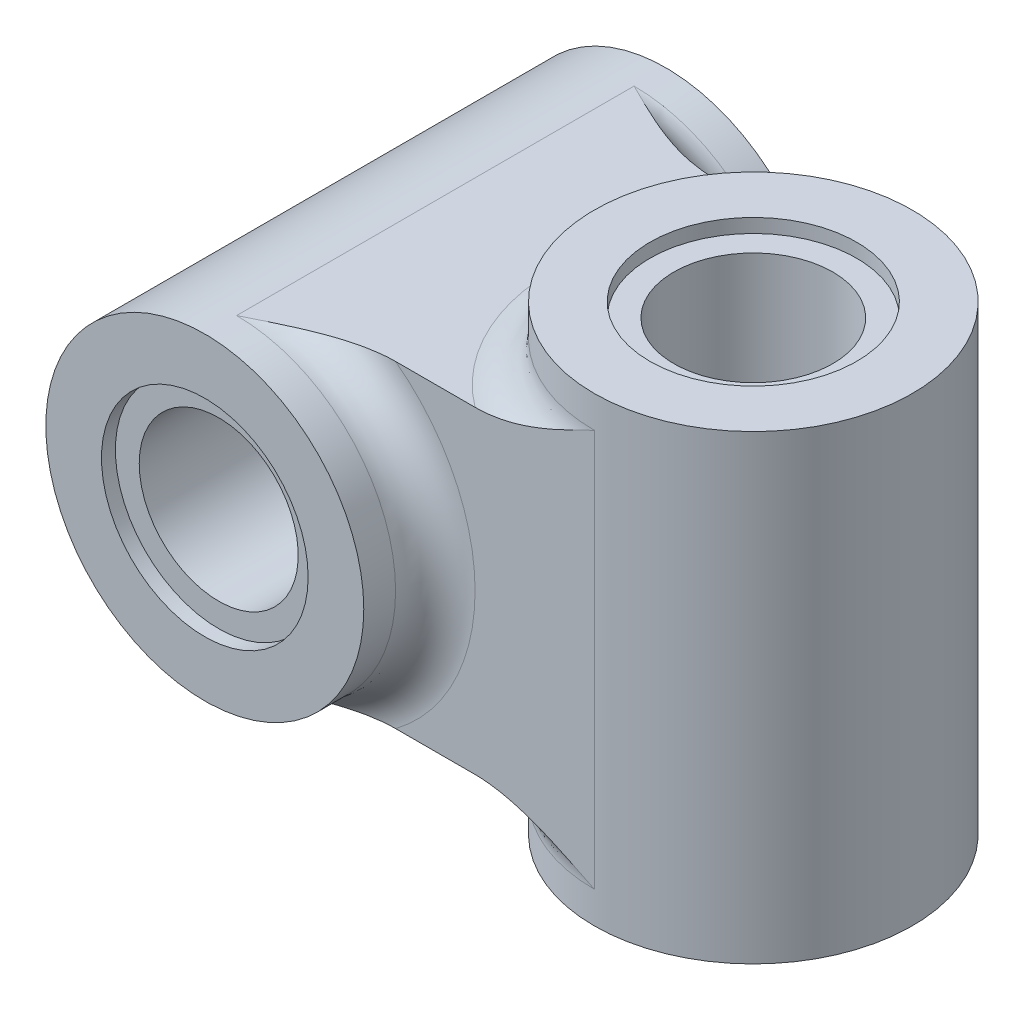
ISO-10303-21;
HEADER;
FILE_DESCRIPTION(('STEP AP214'),'2;1');
FILE_NAME('part.step','',(''),(''),'','','');
FILE_SCHEMA(('AUTOMOTIVE_DESIGN { 1 0 10303 214 1 1 1 1 }'));
ENDSEC;
DATA;
#1=APPLICATION_CONTEXT('core data for automotive mechanical design processes');
#2=APPLICATION_PROTOCOL_DEFINITION('international standard','automotive_design',2000,#1);
#3=PRODUCT_CONTEXT('',#1,'mechanical');
#4=PRODUCT('Part','Part','',(#3));
#5=PRODUCT_RELATED_PRODUCT_CATEGORY('part','',(#4));
#6=PRODUCT_DEFINITION_FORMATION('','',#4);
#7=PRODUCT_DEFINITION_CONTEXT('part definition',#1,'design');
#8=PRODUCT_DEFINITION('design','',#6,#7);
#9=PRODUCT_DEFINITION_SHAPE('','',#8);
#10=(LENGTH_UNIT() NAMED_UNIT(*) SI_UNIT(.MILLI.,.METRE.));
#11=(NAMED_UNIT(*) PLANE_ANGLE_UNIT() SI_UNIT($,.RADIAN.));
#12=(NAMED_UNIT(*) SI_UNIT($,.STERADIAN.) SOLID_ANGLE_UNIT());
#13=UNCERTAINTY_MEASURE_WITH_UNIT(LENGTH_MEASURE(1.E-05),#10,'distance_accuracy_value','');
#14=(GEOMETRIC_REPRESENTATION_CONTEXT(3) GLOBAL_UNCERTAINTY_ASSIGNED_CONTEXT((#13)) GLOBAL_UNIT_ASSIGNED_CONTEXT((#10,
#11,#12)) REPRESENTATION_CONTEXT('',''));
#15=CARTESIAN_POINT('',(0.,0.,0.));
#16=DIRECTION('',(0.,0.,1.));
#17=DIRECTION('',(1.,0.,0.));
#18=AXIS2_PLACEMENT_3D('',#15,#16,#17);
#19=CARTESIAN_POINT('',(40.,29.,29.));
#20=DIRECTION('',(0.,-1.,0.));
#21=DIRECTION('',(0.,0.,-1.));
#22=AXIS2_PLACEMENT_3D('',#19,#20,#21);
#23=CYLINDRICAL_SURFACE('',#22,10.);
#24=CARTESIAN_POINT('',(40.,27.25,29.));
#25=DIRECTION('',(0.,1.,0.));
#26=DIRECTION('',(0.,0.,1.));
#27=AXIS2_PLACEMENT_3D('',#24,#25,#26);
#28=CIRCLE('',#27,10.);
#29=CARTESIAN_POINT('',(40.,27.25,19.));
#30=VERTEX_POINT('',#29);
#31=EDGE_CURVE('E201',#30,#30,#28,.T.);
#32=CARTESIAN_POINT('',(40.,-27.25,29.));
#33=DIRECTION('',(0.,-1.,0.));
#34=DIRECTION('',(0.,0.,-1.));
#35=AXIS2_PLACEMENT_3D('',#32,#33,#34);
#36=CIRCLE('',#35,10.);
#37=CARTESIAN_POINT('',(40.,-27.25,19.));
#38=VERTEX_POINT('',#37);
#39=EDGE_CURVE('E46',#38,#38,#36,.T.);
#40=CARTESIAN_POINT('',(40.,27.25,19.));
#41=CARTESIAN_POINT('',(40.,26.6822916666667,19.));
#42=CARTESIAN_POINT('',(40.,26.1145833333333,19.));
#43=CARTESIAN_POINT('',(40.,24.9791666666667,19.));
#44=CARTESIAN_POINT('',(40.,24.4114583333333,19.));
#45=CARTESIAN_POINT('',(40.,23.2760416666667,19.));
#46=CARTESIAN_POINT('',(40.,22.7083333333333,19.));
#47=CARTESIAN_POINT('',(40.,21.5729166666667,19.));
#48=CARTESIAN_POINT('',(40.,21.0052083333333,19.));
#49=CARTESIAN_POINT('',(40.,19.8697916666667,19.));
#50=CARTESIAN_POINT('',(40.,19.3020833333333,19.));
#51=CARTESIAN_POINT('',(40.,18.1666666666667,19.));
#52=CARTESIAN_POINT('',(40.,17.5989583333333,19.));
#53=CARTESIAN_POINT('',(40.,16.4635416666667,19.));
#54=CARTESIAN_POINT('',(40.,15.8958333333333,19.));
#55=CARTESIAN_POINT('',(40.,14.7604166666667,19.));
#56=CARTESIAN_POINT('',(40.,14.1927083333333,19.));
#57=CARTESIAN_POINT('',(40.,13.0572916666667,19.));
#58=CARTESIAN_POINT('',(40.,12.4895833333333,19.));
#59=CARTESIAN_POINT('',(40.,11.3541666666667,19.));
#60=CARTESIAN_POINT('',(40.,10.7864583333333,19.));
#61=CARTESIAN_POINT('',(40.,9.65104166666667,19.));
#62=CARTESIAN_POINT('',(40.,9.08333333333333,19.));
#63=CARTESIAN_POINT('',(40.,7.94791666666667,19.));
#64=CARTESIAN_POINT('',(40.,7.38020833333333,19.));
#65=CARTESIAN_POINT('',(40.,6.24479166666667,19.));
#66=CARTESIAN_POINT('',(40.,5.67708333333333,19.));
#67=CARTESIAN_POINT('',(40.,4.54166666666667,19.));
#68=CARTESIAN_POINT('',(40.,3.97395833333333,19.));
#69=CARTESIAN_POINT('',(40.,2.83854166666667,19.));
#70=CARTESIAN_POINT('',(40.,2.27083333333333,19.));
#71=CARTESIAN_POINT('',(40.,1.13541666666667,19.));
#72=CARTESIAN_POINT('',(40.,0.567708333333333,19.));
#73=CARTESIAN_POINT('',(40.,-0.567708333333333,19.));
#74=CARTESIAN_POINT('',(40.,-1.13541666666667,19.));
#75=CARTESIAN_POINT('',(40.,-2.27083333333333,19.));
#76=CARTESIAN_POINT('',(40.,-2.83854166666666,19.));
#77=CARTESIAN_POINT('',(40.,-3.97395833333333,19.));
#78=CARTESIAN_POINT('',(40.,-4.54166666666666,19.));
#79=CARTESIAN_POINT('',(40.,-5.67708333333333,19.));
#80=CARTESIAN_POINT('',(40.,-6.24479166666666,19.));
#81=CARTESIAN_POINT('',(40.,-7.38020833333333,19.));
#82=CARTESIAN_POINT('',(40.,-7.94791666666666,19.));
#83=CARTESIAN_POINT('',(40.,-9.08333333333333,19.));
#84=CARTESIAN_POINT('',(40.,-9.65104166666666,19.));
#85=CARTESIAN_POINT('',(40.,-10.7864583333333,19.));
#86=CARTESIAN_POINT('',(40.,-11.3541666666667,19.));
#87=CARTESIAN_POINT('',(40.,-12.4895833333333,19.));
#88=CARTESIAN_POINT('',(40.,-13.0572916666667,19.));
#89=CARTESIAN_POINT('',(40.,-14.1927083333333,19.));
#90=CARTESIAN_POINT('',(40.,-14.7604166666667,19.));
#91=CARTESIAN_POINT('',(40.,-15.8958333333333,19.));
#92=CARTESIAN_POINT('',(40.,-16.4635416666667,19.));
#93=CARTESIAN_POINT('',(40.,-17.5989583333333,19.));
#94=CARTESIAN_POINT('',(40.,-18.1666666666667,19.));
#95=CARTESIAN_POINT('',(40.,-19.3020833333333,19.));
#96=CARTESIAN_POINT('',(40.,-19.8697916666667,19.));
#97=CARTESIAN_POINT('',(40.,-21.0052083333333,19.));
#98=CARTESIAN_POINT('',(40.,-21.5729166666667,19.));
#99=CARTESIAN_POINT('',(40.,-22.7083333333333,19.));
#100=CARTESIAN_POINT('',(40.,-23.2760416666667,19.));
#101=CARTESIAN_POINT('',(40.,-24.4114583333333,19.));
#102=CARTESIAN_POINT('',(40.,-24.9791666666667,19.));
#103=CARTESIAN_POINT('',(40.,-26.1145833333333,19.));
#104=CARTESIAN_POINT('',(40.,-26.6822916666667,19.));
#105=CARTESIAN_POINT('',(40.,-27.25,19.));
#106=B_SPLINE_CURVE_WITH_KNOTS('',3,(#40,#41,#42,#43,#44,#45,#46,#47,#48,#49,#50,#51,#52,#53,
#54,#55,#56,#57,#58,#59,#60,#61,#62,#63,#64,#65,#66,#67,#68,#69,#70,#71,#72,#73,#74,#75,#76,#77,
#78,#79,#80,#81,#82,#83,#84,#85,#86,#87,#88,#89,#90,#91,#92,#93,#94,#95,#96,#97,#98,#99,#100,
#101,#102,#103,#104,#105),.UNSPECIFIED.,.F.,.F.,(4,2,2,2,2,2,2,2,2,2,2,2,2,2,2,2,2,2,2,2,2,2,2,
2,2,2,2,2,2,2,2,2,4),(0.,1.703125,3.40625,5.109375,6.8125,8.515625,10.21875,11.921875,13.625,
15.328125,17.03125,18.734375,20.4375,22.140625,23.84375,25.546875,27.25,28.953125,30.65625,
32.359375,34.0625,35.765625,37.46875,39.171875,40.875,42.578125,44.28125,45.984375,47.6875,
49.390625,51.09375,52.796875,54.5),.UNSPECIFIED.);
#107=EDGE_CURVE('BSEAM41',#30,#38,#106,.T.);
#108=ORIENTED_EDGE('',*,*,#31,.T.);
#109=ORIENTED_EDGE('',*,*,#39,.T.);
#110=ORIENTED_EDGE('',*,*,#107,.T.);
#111=ORIENTED_EDGE('',*,*,#107,.F.);
#112=EDGE_LOOP('',(#108,#110,#109,#111));
#113=FACE_BOUND('',#112,.T.);
#114=ADVANCED_FACE('F41',(#113),#23,.F.);
#115=CARTESIAN_POINT('',(0.,0.,58.));
#116=DIRECTION('',(0.,0.,-1.));
#117=DIRECTION('',(-1.,0.,0.));
#118=AXIS2_PLACEMENT_3D('',#115,#116,#117);
#119=CYLINDRICAL_SURFACE('',#118,10.);
#120=CARTESIAN_POINT('',(0.,0.,1.75));
#121=DIRECTION('',(0.,0.,-1.));
#122=DIRECTION('',(-1.,0.,0.));
#123=AXIS2_PLACEMENT_3D('',#120,#121,#122);
#124=CIRCLE('',#123,10.);
#125=CARTESIAN_POINT('',(-10.,0.,1.75));
#126=VERTEX_POINT('',#125);
#127=EDGE_CURVE('E192',#126,#126,#124,.T.);
#128=CARTESIAN_POINT('',(0.,0.,56.25));
#129=DIRECTION('',(0.,0.,1.));
#130=DIRECTION('',(1.,0.,0.));
#131=AXIS2_PLACEMENT_3D('',#128,#129,#130);
#132=CIRCLE('',#131,10.);
#133=CARTESIAN_POINT('',(-10.,0.,56.25));
#134=VERTEX_POINT('',#133);
#135=EDGE_CURVE('E197',#134,#134,#132,.T.);
#136=CARTESIAN_POINT('',(-10.,0.,1.75));
#137=CARTESIAN_POINT('',(-10.,0.,2.31770833333334));
#138=CARTESIAN_POINT('',(-10.,0.,2.88541666666667));
#139=CARTESIAN_POINT('',(-10.,0.,4.02083333333333));
#140=CARTESIAN_POINT('',(-10.,0.,4.58854166666667));
#141=CARTESIAN_POINT('',(-10.,0.,5.72395833333333));
#142=CARTESIAN_POINT('',(-10.,0.,6.29166666666667));
#143=CARTESIAN_POINT('',(-10.,0.,7.42708333333333));
#144=CARTESIAN_POINT('',(-10.,0.,7.99479166666667));
#145=CARTESIAN_POINT('',(-10.,0.,9.13020833333333));
#146=CARTESIAN_POINT('',(-10.,0.,9.69791666666667));
#147=CARTESIAN_POINT('',(-10.,0.,10.8333333333333));
#148=CARTESIAN_POINT('',(-10.,0.,11.4010416666667));
#149=CARTESIAN_POINT('',(-10.,0.,12.5364583333333));
#150=CARTESIAN_POINT('',(-10.,0.,13.1041666666667));
#151=CARTESIAN_POINT('',(-10.,0.,14.2395833333333));
#152=CARTESIAN_POINT('',(-10.,0.,14.8072916666667));
#153=CARTESIAN_POINT('',(-10.,0.,15.9427083333333));
#154=CARTESIAN_POINT('',(-10.,0.,16.5104166666667));
#155=CARTESIAN_POINT('',(-10.,0.,17.6458333333333));
#156=CARTESIAN_POINT('',(-10.,0.,18.2135416666667));
#157=CARTESIAN_POINT('',(-10.,0.,19.3489583333333));
#158=CARTESIAN_POINT('',(-10.,0.,19.9166666666667));
#159=CARTESIAN_POINT('',(-10.,0.,21.0520833333333));
#160=CARTESIAN_POINT('',(-10.,0.,21.6197916666667));
#161=CARTESIAN_POINT('',(-10.,0.,22.7552083333333));
#162=CARTESIAN_POINT('',(-10.,0.,23.3229166666667));
#163=CARTESIAN_POINT('',(-10.,0.,24.4583333333333));
#164=CARTESIAN_POINT('',(-10.,0.,25.0260416666667));
#165=CARTESIAN_POINT('',(-10.,0.,26.1614583333333));
#166=CARTESIAN_POINT('',(-10.,0.,26.7291666666667));
#167=CARTESIAN_POINT('',(-10.,0.,27.8645833333333));
#168=CARTESIAN_POINT('',(-10.,0.,28.4322916666667));
#169=CARTESIAN_POINT('',(-10.,0.,29.5677083333333));
#170=CARTESIAN_POINT('',(-10.,0.,30.1354166666667));
#171=CARTESIAN_POINT('',(-10.,0.,31.2708333333333));
#172=CARTESIAN_POINT('',(-10.,0.,31.8385416666667));
#173=CARTESIAN_POINT('',(-10.,0.,32.9739583333333));
#174=CARTESIAN_POINT('',(-10.,0.,33.5416666666667));
#175=CARTESIAN_POINT('',(-10.,0.,34.6770833333333));
#176=CARTESIAN_POINT('',(-10.,0.,35.2447916666667));
#177=CARTESIAN_POINT('',(-10.,0.,36.3802083333333));
#178=CARTESIAN_POINT('',(-10.,0.,36.9479166666667));
#179=CARTESIAN_POINT('',(-10.,0.,38.0833333333333));
#180=CARTESIAN_POINT('',(-10.,0.,38.6510416666667));
#181=CARTESIAN_POINT('',(-10.,0.,39.7864583333333));
#182=CARTESIAN_POINT('',(-10.,0.,40.3541666666667));
#183=CARTESIAN_POINT('',(-10.,0.,41.4895833333333));
#184=CARTESIAN_POINT('',(-10.,0.,42.0572916666667));
#185=CARTESIAN_POINT('',(-10.,0.,43.1927083333333));
#186=CARTESIAN_POINT('',(-10.,0.,43.7604166666667));
#187=CARTESIAN_POINT('',(-10.,0.,44.8958333333333));
#188=CARTESIAN_POINT('',(-10.,0.,45.4635416666667));
#189=CARTESIAN_POINT('',(-10.,0.,46.5989583333333));
#190=CARTESIAN_POINT('',(-10.,0.,47.1666666666667));
#191=CARTESIAN_POINT('',(-10.,0.,48.3020833333333));
#192=CARTESIAN_POINT('',(-10.,0.,48.8697916666667));
#193=CARTESIAN_POINT('',(-10.,0.,50.0052083333333));
#194=CARTESIAN_POINT('',(-10.,0.,50.5729166666667));
#195=CARTESIAN_POINT('',(-10.,0.,51.7083333333333));
#196=CARTESIAN_POINT('',(-10.,0.,52.2760416666667));
#197=CARTESIAN_POINT('',(-10.,0.,53.4114583333333));
#198=CARTESIAN_POINT('',(-10.,0.,53.9791666666667));
#199=CARTESIAN_POINT('',(-10.,0.,55.1145833333333));
#200=CARTESIAN_POINT('',(-10.,0.,55.6822916666667));
#201=CARTESIAN_POINT('',(-10.,0.,56.25));
#202=B_SPLINE_CURVE_WITH_KNOTS('',3,(#136,#137,#138,#139,#140,#141,#142,#143,#144,#145,#146,
#147,#148,#149,#150,#151,#152,#153,#154,#155,#156,#157,#158,#159,#160,#161,#162,#163,#164,#165,
#166,#167,#168,#169,#170,#171,#172,#173,#174,#175,#176,#177,#178,#179,#180,#181,#182,#183,#184,
#185,#186,#187,#188,#189,#190,#191,#192,#193,#194,#195,#196,#197,#198,#199,#200,#201),
.UNSPECIFIED.,.F.,.F.,(4,2,2,2,2,2,2,2,2,2,2,2,2,2,2,2,2,2,2,2,2,2,2,2,2,2,2,2,2,2,2,2,4),(0.,
1.703125,3.40625,5.109375,6.8125,8.515625,10.21875,11.921875,13.625,15.328125,17.03125,
18.734375,20.4375,22.140625,23.84375,25.546875,27.25,28.953125,30.65625,32.359375,34.0625,
35.765625,37.46875,39.171875,40.875,42.578125,44.28125,45.984375,47.6875,49.390625,51.09375,
52.796875,54.5),.UNSPECIFIED.);
#203=EDGE_CURVE('BSEAM298',#126,#134,#202,.T.);
#204=ORIENTED_EDGE('',*,*,#127,.T.);
#205=ORIENTED_EDGE('',*,*,#135,.T.);
#206=ORIENTED_EDGE('',*,*,#203,.T.);
#207=ORIENTED_EDGE('',*,*,#203,.F.);
#208=EDGE_LOOP('',(#204,#206,#205,#207));
#209=FACE_BOUND('',#208,.T.);
#210=ADVANCED_FACE('F298',(#209),#119,.F.);
#211=CARTESIAN_POINT('',(0.,0.,58.));
#212=DIRECTION('',(0.,0.,1.));
#213=DIRECTION('',(1.,0.,0.));
#214=AXIS2_PLACEMENT_3D('',#211,#212,#213);
#215=PLANE('',#214);
#216=CARTESIAN_POINT('',(0.,0.,58.));
#217=DIRECTION('',(0.,0.,1.));
#218=DIRECTION('',(1.,0.,0.));
#219=AXIS2_PLACEMENT_3D('',#216,#217,#218);
#220=CIRCLE('',#219,13.);
#221=CARTESIAN_POINT('',(13.,0.,58.));
#222=VERTEX_POINT('',#221);
#223=EDGE_CURVE('E203',#222,#222,#220,.T.);
#224=ORIENTED_EDGE('',*,*,#223,.F.);
#225=EDGE_LOOP('',(#224));
#226=FACE_BOUND('',#225,.T.);
#227=CARTESIAN_POINT('',(0.,0.,58.));
#228=DIRECTION('',(0.,0.,1.));
#229=DIRECTION('',(1.,0.,0.));
#230=AXIS2_PLACEMENT_3D('',#227,#228,#229);
#231=CIRCLE('',#230,20.);
#232=CARTESIAN_POINT('',(20.,0.,58.));
#233=VERTEX_POINT('',#232);
#234=EDGE_CURVE('E124',#233,#233,#231,.T.);
#235=ORIENTED_EDGE('',*,*,#234,.T.);
#236=EDGE_LOOP('',(#235));
#237=FACE_BOUND('',#236,.T.);
#238=ADVANCED_FACE('F305',(#226,#237),#215,.T.);
#239=CARTESIAN_POINT('',(0.,0.,0.));
#240=DIRECTION('',(0.,0.,1.));
#241=DIRECTION('',(1.,0.,0.));
#242=AXIS2_PLACEMENT_3D('',#239,#240,#241);
#243=PLANE('',#242);
#244=CARTESIAN_POINT('',(0.,0.,0.));
#245=DIRECTION('',(0.,0.,-1.));
#246=DIRECTION('',(-1.,0.,0.));
#247=AXIS2_PLACEMENT_3D('',#244,#245,#246);
#248=CIRCLE('',#247,13.);
#249=CARTESIAN_POINT('',(-13.,0.,0.));
#250=VERTEX_POINT('',#249);
#251=EDGE_CURVE('E199',#250,#250,#248,.T.);
#252=ORIENTED_EDGE('',*,*,#251,.F.);
#253=EDGE_LOOP('',(#252));
#254=FACE_BOUND('',#253,.T.);
#255=CARTESIAN_POINT('',(0.,0.,0.));
#256=DIRECTION('',(0.,0.,1.));
#257=DIRECTION('',(1.,0.,0.));
#258=AXIS2_PLACEMENT_3D('',#255,#256,#257);
#259=CIRCLE('',#258,20.);
#260=CARTESIAN_POINT('',(20.,0.,0.));
#261=VERTEX_POINT('',#260);
#262=EDGE_CURVE('E239',#261,#261,#259,.T.);
#263=ORIENTED_EDGE('',*,*,#262,.F.);
#264=EDGE_LOOP('',(#263));
#265=FACE_BOUND('',#264,.T.);
#266=ADVANCED_FACE('F467',(#254,#265),#243,.F.);
#267=CARTESIAN_POINT('',(0.,0.,58.));
#268=DIRECTION('',(0.,0.,-1.));
#269=DIRECTION('',(-1.,0.,0.));
#270=AXIS2_PLACEMENT_3D('',#267,#268,#269);
#271=CYLINDRICAL_SURFACE('',#270,20.);
#272=DIRECTION('',(0.,0.,-1.));
#273=VECTOR('',#272,1.);
#274=CARTESIAN_POINT('',(0.,20.,49.));
#275=LINE('',#274,#273);
#276=CARTESIAN_POINT('',(0.,20.,54.));
#277=VERTEX_POINT('',#276);
#278=CARTESIAN_POINT('',(0.,20.,3.99999999999999));
#279=VERTEX_POINT('',#278);
#280=EDGE_CURVE('E229',#277,#279,#275,.T.);
#281=ORIENTED_EDGE('',*,*,#280,.T.);
#282=CARTESIAN_POINT('',(0.,0.,3.99999999999998));
#283=DIRECTION('',(0.,0.,1.));
#284=DIRECTION('',(0.,-1.,0.));
#285=AXIS2_PLACEMENT_3D('',#282,#283,#284);
#286=CIRCLE('',#285,20.);
#287=CARTESIAN_POINT('',(0.,-20.,3.99999999999998));
#288=VERTEX_POINT('',#287);
#289=EDGE_CURVE('E260',#279,#288,#286,.F.);
#290=ORIENTED_EDGE('',*,*,#289,.T.);
#291=DIRECTION('',(0.,0.,-1.));
#292=VECTOR('',#291,1.);
#293=CARTESIAN_POINT('',(0.,-20.,49.));
#294=LINE('',#293,#292);
#295=CARTESIAN_POINT('',(0.,-20.,54.));
#296=VERTEX_POINT('',#295);
#297=EDGE_CURVE('E116',#296,#288,#294,.T.);
#298=ORIENTED_EDGE('',*,*,#297,.F.);
#299=CARTESIAN_POINT('',(0.,0.,54.));
#300=DIRECTION('',(0.,0.,1.));
#301=DIRECTION('',(1.,0.,0.));
#302=AXIS2_PLACEMENT_3D('',#299,#300,#301);
#303=CIRCLE('',#302,20.);
#304=EDGE_CURVE('E257',#296,#277,#303,.T.);
#305=ORIENTED_EDGE('',*,*,#304,.T.);
#306=EDGE_LOOP('',(#281,#290,#298,#305));
#307=FACE_BOUND('',#306,.T.);
#308=ORIENTED_EDGE('',*,*,#234,.F.);
#309=EDGE_LOOP('',(#308));
#310=FACE_BOUND('',#309,.T.);
#311=ORIENTED_EDGE('',*,*,#262,.T.);
#312=EDGE_LOOP('',(#311));
#313=FACE_BOUND('',#312,.T.);
#314=ADVANCED_FACE('F282',(#307,#310,#313),#271,.T.);
#315=CARTESIAN_POINT('',(40.,-20.,49.));
#316=DIRECTION('',(0.,0.,1.));
#317=DIRECTION('',(1.,0.,0.));
#318=AXIS2_PLACEMENT_3D('',#315,#316,#317);
#319=PLANE('',#318);
#320=DIRECTION('',(-1.,0.,0.));
#321=VECTOR('',#320,1.);
#322=CARTESIAN_POINT('',(40.,20.,49.));
#323=LINE('',#322,#321);
#324=CARTESIAN_POINT('',(25.,20.,49.));
#325=VERTEX_POINT('',#324);
#326=CARTESIAN_POINT('',(15.,20.,49.));
#327=VERTEX_POINT('',#326);
#328=EDGE_CURVE('E233',#325,#327,#323,.T.);
#329=ORIENTED_EDGE('',*,*,#328,.T.);
#330=CARTESIAN_POINT('',(0.,0.,49.));
#331=DIRECTION('',(0.,0.,1.));
#332=DIRECTION('',(1.,0.,0.));
#333=AXIS2_PLACEMENT_3D('',#330,#331,#332);
#334=CIRCLE('',#333,25.);
#335=CARTESIAN_POINT('',(15.,-20.,49.));
#336=VERTEX_POINT('',#335);
#337=EDGE_CURVE('E264',#327,#336,#334,.F.);
#338=ORIENTED_EDGE('',*,*,#337,.T.);
#339=DIRECTION('',(-1.,0.,0.));
#340=VECTOR('',#339,1.);
#341=CARTESIAN_POINT('',(40.,-20.,49.));
#342=LINE('',#341,#340);
#343=CARTESIAN_POINT('',(25.,-20.,49.));
#344=VERTEX_POINT('',#343);
#345=EDGE_CURVE('E236',#344,#336,#342,.T.);
#346=ORIENTED_EDGE('',*,*,#345,.F.);
#347=CARTESIAN_POINT('',(25.,-20.,49.));
#348=CARTESIAN_POINT('',(25.2651282089429,-20.0000248440085,49.));
#349=CARTESIAN_POINT('',(25.5301771044987,-20.007589934337,49.));
#350=CARTESIAN_POINT('',(26.0593880846254,-20.0364294351582,49.));
#351=CARTESIAN_POINT('',(26.3235505882963,-20.0576960351639,49.));
#352=CARTESIAN_POINT('',(26.8497890843893,-20.1124898408836,49.));
#353=CARTESIAN_POINT('',(27.1118689280912,-20.145980810748,49.));
#354=CARTESIAN_POINT('',(27.6343923106904,-20.2240499150372,49.));
#355=CARTESIAN_POINT('',(27.8948355873029,-20.2686297823921,49.));
#356=CARTESIAN_POINT('',(28.6664609884388,-20.4160433975464,49.));
#357=CARTESIAN_POINT('',(29.1749087512093,-20.5333381947335,49.));
#358=CARTESIAN_POINT('',(30.1837126611257,-20.7995778005164,49.));
#359=CARTESIAN_POINT('',(30.6840614597819,-20.9485497892506,49.));
#360=CARTESIAN_POINT('',(31.5605831445864,-21.2342047748402,49.));
#361=CARTESIAN_POINT('',(31.9384874405667,-21.3656435859749,49.));
#362=CARTESIAN_POINT('',(32.6897037488905,-21.6410837307938,49.));
#363=CARTESIAN_POINT('',(33.0630153714214,-21.7850861225578,49.));
#364=CARTESIAN_POINT('',(34.176661641421,-22.2325984737774,49.));
#365=CARTESIAN_POINT('',(34.9107431272673,-22.5516256043198,49.));
#366=CARTESIAN_POINT('',(36.3696325965115,-23.216950662706,49.));
#367=CARTESIAN_POINT('',(37.0943930587858,-23.5633504064254,49.));
#368=CARTESIAN_POINT('',(38.5376845637521,-24.2689287241272,49.));
#369=CARTESIAN_POINT('',(39.2562150092713,-24.6281085066499,49.));
#370=CARTESIAN_POINT('',(39.9831345201157,-24.9915672610964,49.));
#371=CARTESIAN_POINT('',(39.9915672605557,-24.9957836313378,49.));
#372=CARTESIAN_POINT('',(40.,-25.,49.));
#373=B_SPLINE_CURVE_WITH_KNOTS('',3,(#347,#348,#349,#350,#351,#352,#353,#354,#355,#356,#357,
#358,#359,#360,#361,#362,#363,#364,#365,#366,#367,#368,#369,#370,#371,#372),.UNSPECIFIED.,.F.,
.F.,(4,2,2,2,2,2,2,2,2,2,2,2,4),(0.,0.795162748327174,1.58987261810577,2.38224566558403,
3.17474261995516,4.73875375654246,6.30411232391702,7.50419539676254,8.70437963595933,
11.1046360659497,13.5142837354925,15.9241598813816,15.952444152629),.UNSPECIFIED.);
#374=CARTESIAN_POINT('',(40.,-25.,49.));
#375=VERTEX_POINT('',#374);
#376=EDGE_CURVE('E111',#344,#375,#373,.T.);
#377=ORIENTED_EDGE('',*,*,#376,.T.);
#378=DIRECTION('',(0.,1.,0.));
#379=VECTOR('',#378,1.);
#380=CARTESIAN_POINT('',(40.,-20.,49.));
#381=LINE('',#380,#379);
#382=CARTESIAN_POINT('',(40.,25.,49.));
#383=VERTEX_POINT('',#382);
#384=EDGE_CURVE('E106',#375,#383,#381,.T.);
#385=ORIENTED_EDGE('',*,*,#384,.T.);
#386=CARTESIAN_POINT('',(25.,20.,49.));
#387=CARTESIAN_POINT('',(25.2651282089429,20.0000248440085,49.));
#388=CARTESIAN_POINT('',(25.5301771044987,20.007589934337,49.));
#389=CARTESIAN_POINT('',(26.0593880846254,20.0364294351582,49.));
#390=CARTESIAN_POINT('',(26.3235505882963,20.0576960351639,49.));
#391=CARTESIAN_POINT('',(26.8497890843893,20.1124898408836,49.));
#392=CARTESIAN_POINT('',(27.1118689280912,20.145980810748,49.));
#393=CARTESIAN_POINT('',(27.6343923106904,20.2240499150372,49.));
#394=CARTESIAN_POINT('',(27.8948355873029,20.2686297823921,49.));
#395=CARTESIAN_POINT('',(28.6664609884388,20.4160433975464,49.));
#396=CARTESIAN_POINT('',(29.1749087512093,20.5333381947335,49.));
#397=CARTESIAN_POINT('',(30.1837126611257,20.7995778005164,49.));
#398=CARTESIAN_POINT('',(30.6840614597819,20.9485497892506,49.));
#399=CARTESIAN_POINT('',(31.5605831445864,21.2342047748402,49.));
#400=CARTESIAN_POINT('',(31.9384874405667,21.3656435859748,49.));
#401=CARTESIAN_POINT('',(32.6897037488905,21.6410837307938,49.));
#402=CARTESIAN_POINT('',(33.0630153714214,21.7850861225578,49.));
#403=CARTESIAN_POINT('',(34.176661641421,22.2325984737774,49.));
#404=CARTESIAN_POINT('',(34.9107431272673,22.5516256043198,49.));
#405=CARTESIAN_POINT('',(36.3696325965115,23.216950662706,49.));
#406=CARTESIAN_POINT('',(37.0943930587858,23.5633504064254,49.));
#407=CARTESIAN_POINT('',(38.5376845637521,24.2689287241272,49.));
#408=CARTESIAN_POINT('',(39.2562150092713,24.6281085066499,49.));
#409=CARTESIAN_POINT('',(39.9831345201157,24.9915672610964,49.));
#410=CARTESIAN_POINT('',(39.9915672605557,24.9957836313378,49.));
#411=CARTESIAN_POINT('',(40.,25.,49.));
#412=B_SPLINE_CURVE_WITH_KNOTS('',3,(#386,#387,#388,#389,#390,#391,#392,#393,#394,#395,#396,
#397,#398,#399,#400,#401,#402,#403,#404,#405,#406,#407,#408,#409,#410,#411),.UNSPECIFIED.,.F.,
.F.,(4,2,2,2,2,2,2,2,2,2,2,2,4),(0.,0.795162748327174,1.58987261810577,2.38224566558403,
3.17474261995516,4.73875375654246,6.30411232391702,7.50419539676255,8.70437963595933,
11.1046360659497,13.5142837354925,15.9241598813816,15.952444152629),.UNSPECIFIED.);
#413=EDGE_CURVE('E65',#383,#325,#412,.F.);
#414=ORIENTED_EDGE('',*,*,#413,.T.);
#415=EDGE_LOOP('',(#329,#338,#346,#377,#385,#414));
#416=FACE_BOUND('',#415,.T.);
#417=ADVANCED_FACE('F108',(#416),#319,.T.);
#418=CARTESIAN_POINT('',(40.,-20.,49.));
#419=DIRECTION('',(0.,1.,0.));
#420=DIRECTION('',(0.,0.,1.));
#421=AXIS2_PLACEMENT_3D('',#418,#419,#420);
#422=PLANE('',#421);
#423=DIRECTION('',(-1.,0.,0.));
#424=VECTOR('',#423,1.);
#425=CARTESIAN_POINT('',(40.,-20.,8.99999999999998));
#426=LINE('',#425,#424);
#427=CARTESIAN_POINT('',(25.,-20.,8.99999999999998));
#428=VERTEX_POINT('',#427);
#429=CARTESIAN_POINT('',(15.,-20.,8.99999999999998));
#430=VERTEX_POINT('',#429);
#431=EDGE_CURVE('E240',#428,#430,#426,.T.);
#432=ORIENTED_EDGE('',*,*,#431,.F.);
#433=CARTESIAN_POINT('',(40.,-20.,29.));
#434=DIRECTION('',(0.,1.,0.));
#435=DIRECTION('',(0.,0.,1.));
#436=AXIS2_PLACEMENT_3D('',#433,#434,#435);
#437=CIRCLE('',#436,25.);
#438=EDGE_CURVE('E252',#428,#344,#437,.T.);
#439=ORIENTED_EDGE('',*,*,#438,.T.);
#440=ORIENTED_EDGE('',*,*,#345,.T.);
#441=CARTESIAN_POINT('',(15.,-20.,49.));
#442=CARTESIAN_POINT('',(14.734871791058,-20.,49.0000248440085));
#443=CARTESIAN_POINT('',(14.4698228955031,-20.,49.007589934337));
#444=CARTESIAN_POINT('',(13.9406119153781,-20.,49.036429435158));
#445=CARTESIAN_POINT('',(13.6764494117081,-20.,49.0576960351635));
#446=CARTESIAN_POINT('',(13.1502109156166,-20.,49.1124898408829));
#447=CARTESIAN_POINT('',(12.8881310719155,-20.,49.1459808107472));
#448=CARTESIAN_POINT('',(12.3656076893176,-20.,49.2240499150359));
#449=CARTESIAN_POINT('',(12.1051644127057,-20.,49.2686297823906));
#450=CARTESIAN_POINT('',(11.3335390115688,-20.,49.4160433975447));
#451=CARTESIAN_POINT('',(10.8250912487966,-20.,49.533338194732));
#452=CARTESIAN_POINT('',(9.81628733887715,-20.,49.7995778005156));
#453=CARTESIAN_POINT('',(9.31593854021946,-20.,49.9485497892502));
#454=CARTESIAN_POINT('',(8.43941685541347,-20.,50.2342047748402));
#455=CARTESIAN_POINT('',(8.06151255943296,-20.,50.3656435859749));
#456=CARTESIAN_POINT('',(7.31029625110899,-20.,50.641083730794));
#457=CARTESIAN_POINT('',(6.9369846285781,-20.,50.7850861225583));
#458=CARTESIAN_POINT('',(5.82333835857747,-20.,51.2325984737775));
#459=CARTESIAN_POINT('',(5.08925687272968,-20.,51.5516256043185));
#460=CARTESIAN_POINT('',(3.63036740348735,-20.,52.2169506627092));
#461=CARTESIAN_POINT('',(2.90560694121646,-20.,52.5633504064345));
#462=CARTESIAN_POINT('',(1.46231543624279,-20.,53.2689287241194));
#463=CARTESIAN_POINT('',(0.74378499071274,-20.,53.6281085066193));
#464=CARTESIAN_POINT('',(0.0168654798839559,-20.,53.9915672610957));
#465=CARTESIAN_POINT('',(0.00843273944410271,-20.,53.9957836313375));
#466=CARTESIAN_POINT('',(0.,-20.,54.));
#467=B_SPLINE_CURVE_WITH_KNOTS('',3,(#441,#442,#443,#444,#445,#446,#447,#448,#449,#450,#451,
#452,#453,#454,#455,#456,#457,#458,#459,#460,#461,#462,#463,#464,#465,#466),.UNSPECIFIED.,.F.,
.F.,(4,2,2,2,2,2,2,2,2,2,2,2,4),(0.,0.795162748324529,1.58987261810048,2.38224566557666,
3.17474261994572,4.73875375653805,6.30411232391702,7.50419539676299,8.70437963596004,
11.1046360659524,13.5142837354942,15.9241598813816,15.952444152629),.UNSPECIFIED.);
#468=EDGE_CURVE('E12',#336,#296,#467,.T.);
#469=ORIENTED_EDGE('',*,*,#468,.T.);
#470=ORIENTED_EDGE('',*,*,#297,.T.);
#471=CARTESIAN_POINT('',(15.,-20.,8.99999999999998));
#472=CARTESIAN_POINT('',(14.7348717910581,-20.,8.99997515599151));
#473=CARTESIAN_POINT('',(14.4698228955031,-20.,8.99241006566299));
#474=CARTESIAN_POINT('',(13.9406119153783,-20.,8.96357056484199));
#475=CARTESIAN_POINT('',(13.6764494117083,-20.,8.94230396483651));
#476=CARTESIAN_POINT('',(13.1502109156169,-20.,8.88751015911715));
#477=CARTESIAN_POINT('',(12.8881310719158,-20.,8.85401918925287));
#478=CARTESIAN_POINT('',(12.3656076893179,-20.,8.77595008496414));
#479=CARTESIAN_POINT('',(12.1051644127061,-20.,8.73137021760948));
#480=CARTESIAN_POINT('',(11.3335390115692,-20.,8.58395660245538));
#481=CARTESIAN_POINT('',(10.8250912487969,-20.,8.46666180526804));
#482=CARTESIAN_POINT('',(9.81628733887729,-20.,8.20042219948441));
#483=CARTESIAN_POINT('',(9.31593854021953,-20.,8.0514502107498));
#484=CARTESIAN_POINT('',(8.43941685541347,-20.,7.76579522515975));
#485=CARTESIAN_POINT('',(8.06151255943294,-20.,7.63435641402509));
#486=CARTESIAN_POINT('',(7.31029625110897,-20.,7.35891626920594));
#487=CARTESIAN_POINT('',(6.93698462857808,-20.,7.2149138774417));
#488=CARTESIAN_POINT('',(5.8233383585774,-20.,6.76740152622248));
#489=CARTESIAN_POINT('',(5.08925687272954,-20.,6.4483743956816));
#490=CARTESIAN_POINT('',(3.6303674034873,-20.,5.78304933729061));
#491=CARTESIAN_POINT('',(2.90560694121658,-20.,5.43664959356502));
#492=CARTESIAN_POINT('',(1.46231543624254,-20.,4.73107127588095));
#493=CARTESIAN_POINT('',(0.743784990711952,-20.,4.37189149338223));
#494=CARTESIAN_POINT('',(0.016865479883942,-20.,4.00843273890429));
#495=CARTESIAN_POINT('',(0.00843273944409571,-20.,4.00421636866253));
#496=CARTESIAN_POINT('',(0.,-20.,3.99999999999998));
#497=B_SPLINE_CURVE_WITH_KNOTS('',3,(#471,#472,#473,#474,#475,#476,#477,#478,#479,#480,#481,
#482,#483,#484,#485,#486,#487,#488,#489,#490,#491,#492,#493,#494,#495,#496),.UNSPECIFIED.,.F.,
.F.,(4,2,2,2,2,2,2,2,2,2,2,2,4),(0.,0.795162748324397,1.58987261810021,2.3822456655763,
3.17474261994525,4.73875375653783,6.30411232391702,7.50419539676301,8.70437963596008,
11.1046360659526,13.5142837354943,15.9241598813816,15.952444152629),.UNSPECIFIED.);
#498=EDGE_CURVE('E133',#288,#430,#497,.F.);
#499=ORIENTED_EDGE('',*,*,#498,.T.);
#500=EDGE_LOOP('',(#432,#439,#440,#469,#470,#499));
#501=FACE_BOUND('',#500,.T.);
#502=ADVANCED_FACE('F178',(#501),#422,.F.);
#503=CARTESIAN_POINT('',(40.,-20.,8.99999999999998));
#504=DIRECTION('',(0.,0.,1.));
#505=DIRECTION('',(0.,-1.,0.));
#506=AXIS2_PLACEMENT_3D('',#503,#504,#505);
#507=PLANE('',#506);
#508=ORIENTED_EDGE('',*,*,#431,.T.);
#509=CARTESIAN_POINT('',(0.,0.,8.99999999999998));
#510=DIRECTION('',(0.,0.,1.));
#511=DIRECTION('',(0.,-1.,0.));
#512=AXIS2_PLACEMENT_3D('',#509,#510,#511);
#513=CIRCLE('',#512,25.);
#514=CARTESIAN_POINT('',(15.,20.,8.99999999999998));
#515=VERTEX_POINT('',#514);
#516=EDGE_CURVE('E254',#430,#515,#513,.T.);
#517=ORIENTED_EDGE('',*,*,#516,.T.);
#518=DIRECTION('',(-1.,0.,0.));
#519=VECTOR('',#518,1.);
#520=CARTESIAN_POINT('',(40.,20.,8.99999999999998));
#521=LINE('',#520,#519);
#522=CARTESIAN_POINT('',(25.,20.,8.99999999999998));
#523=VERTEX_POINT('',#522);
#524=EDGE_CURVE('E243',#523,#515,#521,.T.);
#525=ORIENTED_EDGE('',*,*,#524,.F.);
#526=CARTESIAN_POINT('',(25.,20.,8.99999999999998));
#527=CARTESIAN_POINT('',(25.265128208942,20.0000248440085,8.99999999999998));
#528=CARTESIAN_POINT('',(25.5301771044969,20.007589934337,8.99999999999998));
#529=CARTESIAN_POINT('',(26.0593880846219,20.036429435158,8.99999999999998));
#530=CARTESIAN_POINT('',(26.3235505882919,20.0576960351635,8.99999999999998));
#531=CARTESIAN_POINT('',(26.8497890843833,20.1124898408829,8.99999999999998));
#532=CARTESIAN_POINT('',(27.1118689280845,20.1459808107471,8.99999999999998));
#533=CARTESIAN_POINT('',(27.6343923106824,20.2240499150359,8.99999999999998));
#534=CARTESIAN_POINT('',(27.8948355872942,20.2686297823906,8.99999999999998));
#535=CARTESIAN_POINT('',(28.6664609884311,20.4160433975447,8.99999999999998));
#536=CARTESIAN_POINT('',(29.1749087512034,20.533338194732,8.99999999999998));
#537=CARTESIAN_POINT('',(30.1837126611228,20.7995778005156,8.99999999999998));
#538=CARTESIAN_POINT('',(30.6840614597805,20.9485497892502,8.99999999999998));
#539=CARTESIAN_POINT('',(31.5605831445865,21.2342047748402,8.99999999999998));
#540=CARTESIAN_POINT('',(31.9384874405671,21.3656435859749,8.99999999999998));
#541=CARTESIAN_POINT('',(32.689703748891,21.641083730794,8.99999999999998));
#542=CARTESIAN_POINT('',(33.0630153714219,21.7850861225583,8.99999999999998));
#543=CARTESIAN_POINT('',(34.1766616414226,22.2325984737775,8.99999999999998));
#544=CARTESIAN_POINT('',(34.9107431272704,22.5516256043184,8.99999999999998));
#545=CARTESIAN_POINT('',(36.3696325965127,23.2169506627093,8.99999999999998));
#546=CARTESIAN_POINT('',(37.0943930587835,23.5633504064346,8.99999999999998));
#547=CARTESIAN_POINT('',(38.5376845637573,24.2689287241193,8.99999999999998));
#548=CARTESIAN_POINT('',(39.2562150092874,24.6281085066189,8.99999999999998));
#549=CARTESIAN_POINT('',(39.983134520116,24.9915672610957,8.99999999999998));
#550=CARTESIAN_POINT('',(39.9915672605559,24.9957836313375,8.99999999999998));
#551=CARTESIAN_POINT('',(40.,25.,8.99999999999998));
#552=B_SPLINE_CURVE_WITH_KNOTS('',3,(#526,#527,#528,#529,#530,#531,#532,#533,#534,#535,#536,
#537,#538,#539,#540,#541,#542,#543,#544,#545,#546,#547,#548,#549,#550,#551),.UNSPECIFIED.,.F.,
.F.,(4,2,2,2,2,2,2,2,2,2,2,2,4),(0.,0.795162748324496,1.58987261810041,2.38224566557658,
3.17474261994561,4.738753756538,6.30411232391703,7.50419539676301,8.70437963596006,
11.1046360659525,13.5142837354942,15.9241598813816,15.952444152629),.UNSPECIFIED.);
#553=CARTESIAN_POINT('',(40.,25.,8.99999999999998));
#554=VERTEX_POINT('',#553);
#555=EDGE_CURVE('E130',#523,#554,#552,.T.);
#556=ORIENTED_EDGE('',*,*,#555,.T.);
#557=DIRECTION('',(0.,1.,0.));
#558=VECTOR('',#557,1.);
#559=CARTESIAN_POINT('',(40.,-20.,8.99999999999998));
#560=LINE('',#559,#558);
#561=CARTESIAN_POINT('',(40.,-25.,8.99999999999998));
#562=VERTEX_POINT('',#561);
#563=EDGE_CURVE('E115',#562,#554,#560,.T.);
#564=ORIENTED_EDGE('',*,*,#563,.F.);
#565=CARTESIAN_POINT('',(25.,-20.,8.99999999999998));
#566=CARTESIAN_POINT('',(25.2651282089405,-20.0000248440085,8.99999999999998));
#567=CARTESIAN_POINT('',(25.5301771044939,-20.0075899343369,8.99999999999998));
#568=CARTESIAN_POINT('',(26.0593880846159,-20.0364294351576,8.99999999999998));
#569=CARTESIAN_POINT('',(26.3235505882844,-20.0576960351628,8.99999999999998));
#570=CARTESIAN_POINT('',(26.8497890843731,-20.1124898408817,8.99999999999998));
#571=CARTESIAN_POINT('',(27.1118689280732,-20.1459808107456,8.99999999999998));
#572=CARTESIAN_POINT('',(27.6343923106688,-20.2240499150337,8.99999999999998));
#573=CARTESIAN_POINT('',(27.8948355872795,-20.268629782388,8.99999999999998));
#574=CARTESIAN_POINT('',(28.6664609884182,-20.4160433975418,8.99999999999998));
#575=CARTESIAN_POINT('',(29.1749087511933,-20.5333381947295,8.99999999999998));
#576=CARTESIAN_POINT('',(30.183712661118,-20.7995778005142,8.99999999999998));
#577=CARTESIAN_POINT('',(30.6840614597781,-20.9485497892495,8.99999999999998));
#578=CARTESIAN_POINT('',(31.5605831445868,-21.2342047748403,8.99999999999998));
#579=CARTESIAN_POINT('',(31.9384874405676,-21.365643585975,8.99999999999998));
#580=CARTESIAN_POINT('',(32.6897037488918,-21.6410837307944,8.99999999999998));
#581=CARTESIAN_POINT('',(33.0630153714227,-21.785086122559,8.99999999999998));
#582=CARTESIAN_POINT('',(34.176661641425,-22.2325984737777,8.99999999999998));
#583=CARTESIAN_POINT('',(34.9107431272754,-22.5516256043162,8.99999999999998));
#584=CARTESIAN_POINT('',(36.3696325965144,-23.2169506627146,8.99999999999998));
#585=CARTESIAN_POINT('',(37.0943930587795,-23.5633504064502,8.99999999999999));
#586=CARTESIAN_POINT('',(38.5376845637659,-24.268928724106,8.99999999999997));
#587=CARTESIAN_POINT('',(39.2562150093145,-24.6281085065665,8.99999999999993));
#588=CARTESIAN_POINT('',(39.9831345201166,-24.9915672610944,8.99999999999998));
#589=CARTESIAN_POINT('',(39.9915672605562,-24.9957836313368,8.99999999999998));
#590=CARTESIAN_POINT('',(40.,-25.,8.99999999999998));
#591=B_SPLINE_CURVE_WITH_KNOTS('',3,(#565,#566,#567,#568,#569,#570,#571,#572,#573,#574,#575,
#576,#577,#578,#579,#580,#581,#582,#583,#584,#585,#586,#587,#588,#589,#590),.UNSPECIFIED.,.F.,
.F.,(4,2,2,2,2,2,2,2,2,2,2,2,4),(0.,0.795162748319988,1.58987261809139,2.38224566556401,
3.1747426199295,4.73875375653048,6.30411232391703,7.50419539676373,8.70437963596123,
11.1046360659571,13.5142837354969,15.9241598813814,15.952444152629),.UNSPECIFIED.);
#592=EDGE_CURVE('E266',#562,#428,#591,.F.);
#593=ORIENTED_EDGE('',*,*,#592,.T.);
#594=EDGE_LOOP('',(#508,#517,#525,#556,#564,#593));
#595=FACE_BOUND('',#594,.T.);
#596=ADVANCED_FACE('F182',(#595),#507,.F.);
#597=CARTESIAN_POINT('',(40.,20.,49.));
#598=DIRECTION('',(0.,1.,0.));
#599=DIRECTION('',(0.,0.,1.));
#600=AXIS2_PLACEMENT_3D('',#597,#598,#599);
#601=PLANE('',#600);
#602=ORIENTED_EDGE('',*,*,#328,.F.);
#603=CARTESIAN_POINT('',(40.,20.,29.));
#604=DIRECTION('',(0.,1.,0.));
#605=DIRECTION('',(0.,0.,1.));
#606=AXIS2_PLACEMENT_3D('',#603,#604,#605);
#607=CIRCLE('',#606,25.);
#608=EDGE_CURVE('E129',#325,#523,#607,.F.);
#609=ORIENTED_EDGE('',*,*,#608,.T.);
#610=ORIENTED_EDGE('',*,*,#524,.T.);
#611=CARTESIAN_POINT('',(15.,20.,8.99999999999998));
#612=CARTESIAN_POINT('',(14.7348717910581,20.,8.99997515599152));
#613=CARTESIAN_POINT('',(14.4698228955032,20.,8.992410065663));
#614=CARTESIAN_POINT('',(13.9406119153783,20.,8.963570564842));
#615=CARTESIAN_POINT('',(13.6764494117083,20.,8.94230396483652));
#616=CARTESIAN_POINT('',(13.150210915617,20.,8.88751015911716));
#617=CARTESIAN_POINT('',(12.8881310719159,20.,8.85401918925288));
#618=CARTESIAN_POINT('',(12.3656076893181,20.,8.77595008496417));
#619=CARTESIAN_POINT('',(12.1051644127063,20.,8.73137021760951));
#620=CARTESIAN_POINT('',(11.3335390115693,20.,8.58395660245541));
#621=CARTESIAN_POINT('',(10.825091248797,20.,8.46666180526806));
#622=CARTESIAN_POINT('',(9.81628733887733,20.,8.20042219948443));
#623=CARTESIAN_POINT('',(9.31593854021955,20.,8.05145021074981));
#624=CARTESIAN_POINT('',(8.43941685541347,20.,7.76579522515976));
#625=CARTESIAN_POINT('',(8.06151255943294,20.,7.63435641402509));
#626=CARTESIAN_POINT('',(7.31029625110897,20.,7.35891626920594));
#627=CARTESIAN_POINT('',(6.93698462857807,20.,7.2149138774417));
#628=CARTESIAN_POINT('',(5.82333835857738,20.,6.76740152622248));
#629=CARTESIAN_POINT('',(5.0892568727295,20.,6.44837439568163));
#630=CARTESIAN_POINT('',(3.63036740348729,20.,5.78304933729057));
#631=CARTESIAN_POINT('',(2.90560694121662,20.,5.43664959356489));
#632=CARTESIAN_POINT('',(1.46231543624247,20.,4.73107127588107));
#633=CARTESIAN_POINT('',(0.743784990711718,20.,4.37189149338269));
#634=CARTESIAN_POINT('',(0.0168654798839386,20.,4.00843273890431));
#635=CARTESIAN_POINT('',(0.00843273944409399,20.,4.00421636866254));
#636=CARTESIAN_POINT('',(0.,20.,3.99999999999998));
#637=B_SPLINE_CURVE_WITH_KNOTS('',3,(#611,#612,#613,#614,#615,#616,#617,#618,#619,#620,#621,
#622,#623,#624,#625,#626,#627,#628,#629,#630,#631,#632,#633,#634,#635,#636),.UNSPECIFIED.,.F.,
.F.,(4,2,2,2,2,2,2,2,2,2,2,2,4),(0.,0.795162748324356,1.58987261810013,2.38224566557619,
3.17474261994511,4.73875375653776,6.30411232391702,7.50419539676301,8.70437963596008,
11.1046360659526,13.5142837354943,15.9241598813816,15.952444152629),.UNSPECIFIED.);
#638=EDGE_CURVE('E167',#515,#279,#637,.T.);
#639=ORIENTED_EDGE('',*,*,#638,.T.);
#640=ORIENTED_EDGE('',*,*,#280,.F.);
#641=CARTESIAN_POINT('',(15.,20.,49.));
#642=CARTESIAN_POINT('',(14.734871791058,20.,49.0000248440085));
#643=CARTESIAN_POINT('',(14.4698228955031,20.,49.007589934337));
#644=CARTESIAN_POINT('',(13.9406119153781,20.,49.036429435158));
#645=CARTESIAN_POINT('',(13.6764494117081,20.,49.0576960351635));
#646=CARTESIAN_POINT('',(13.1502109156166,20.,49.1124898408829));
#647=CARTESIAN_POINT('',(12.8881310719155,20.,49.1459808107472));
#648=CARTESIAN_POINT('',(12.3656076893176,20.,49.2240499150359));
#649=CARTESIAN_POINT('',(12.1051644127057,20.,49.2686297823906));
#650=CARTESIAN_POINT('',(11.3335390115688,20.,49.4160433975447));
#651=CARTESIAN_POINT('',(10.8250912487966,20.,49.533338194732));
#652=CARTESIAN_POINT('',(9.81628733887715,20.,49.7995778005156));
#653=CARTESIAN_POINT('',(9.31593854021946,20.,49.9485497892502));
#654=CARTESIAN_POINT('',(8.43941685541347,20.,50.2342047748402));
#655=CARTESIAN_POINT('',(8.06151255943296,20.,50.3656435859749));
#656=CARTESIAN_POINT('',(7.31029625110899,20.,50.641083730794));
#657=CARTESIAN_POINT('',(6.9369846285781,20.,50.7850861225583));
#658=CARTESIAN_POINT('',(5.82333835857747,20.,51.2325984737775));
#659=CARTESIAN_POINT('',(5.08925687272968,20.,51.5516256043185));
#660=CARTESIAN_POINT('',(3.63036740348735,20.,52.2169506627092));
#661=CARTESIAN_POINT('',(2.90560694121646,20.,52.5633504064345));
#662=CARTESIAN_POINT('',(1.46231543624279,20.,53.2689287241194));
#663=CARTESIAN_POINT('',(0.74378499071274,20.,53.6281085066193));
#664=CARTESIAN_POINT('',(0.0168654798839559,20.,53.9915672610957));
#665=CARTESIAN_POINT('',(0.00843273944410271,20.,53.9957836313375));
#666=CARTESIAN_POINT('',(0.,20.,54.));
#667=B_SPLINE_CURVE_WITH_KNOTS('',3,(#641,#642,#643,#644,#645,#646,#647,#648,#649,#650,#651,
#652,#653,#654,#655,#656,#657,#658,#659,#660,#661,#662,#663,#664,#665,#666),.UNSPECIFIED.,.F.,
.F.,(4,2,2,2,2,2,2,2,2,2,2,2,4),(0.,0.795162748324529,1.58987261810048,2.38224566557666,
3.17474261994572,4.73875375653805,6.30411232391702,7.50419539676299,8.70437963596004,
11.1046360659524,13.5142837354942,15.9241598813816,15.952444152629),.UNSPECIFIED.);
#668=EDGE_CURVE('E51',#277,#327,#667,.F.);
#669=ORIENTED_EDGE('',*,*,#668,.T.);
#670=EDGE_LOOP('',(#602,#609,#610,#639,#640,#669));
#671=FACE_BOUND('',#670,.T.);
#672=ADVANCED_FACE('F277',(#671),#601,.T.);
#673=CARTESIAN_POINT('',(40.,29.,29.));
#674=DIRECTION('',(0.,-1.,0.));
#675=DIRECTION('',(0.,0.,-1.));
#676=AXIS2_PLACEMENT_3D('',#673,#674,#675);
#677=CYLINDRICAL_SURFACE('',#676,20.);
#678=CARTESIAN_POINT('',(40.,29.,29.));
#679=DIRECTION('',(0.,1.,0.));
#680=DIRECTION('',(0.,0.,1.));
#681=AXIS2_PLACEMENT_3D('',#678,#679,#680);
#682=CIRCLE('',#681,20.);
#683=CARTESIAN_POINT('',(40.,29.,49.));
#684=VERTEX_POINT('',#683);
#685=EDGE_CURVE('E226',#684,#684,#682,.T.);
#686=ORIENTED_EDGE('',*,*,#685,.F.);
#687=EDGE_LOOP('',(#686));
#688=FACE_BOUND('',#687,.T.);
#689=CARTESIAN_POINT('',(40.,-29.,29.));
#690=DIRECTION('',(0.,1.,0.));
#691=DIRECTION('',(0.,0.,1.));
#692=AXIS2_PLACEMENT_3D('',#689,#690,#691);
#693=CIRCLE('',#692,20.);
#694=CARTESIAN_POINT('',(40.,-29.,49.));
#695=VERTEX_POINT('',#694);
#696=EDGE_CURVE('E195',#695,#695,#693,.T.);
#697=ORIENTED_EDGE('',*,*,#696,.T.);
#698=EDGE_LOOP('',(#697));
#699=FACE_BOUND('',#698,.T.);
#700=CARTESIAN_POINT('',(40.,-25.,29.));
#701=DIRECTION('',(0.,1.,0.));
#702=DIRECTION('',(0.,0.,1.));
#703=AXIS2_PLACEMENT_3D('',#700,#701,#702);
#704=CIRCLE('',#703,20.);
#705=EDGE_CURVE('E123',#375,#562,#704,.F.);
#706=ORIENTED_EDGE('',*,*,#705,.T.);
#707=ORIENTED_EDGE('',*,*,#563,.T.);
#708=CARTESIAN_POINT('',(40.,25.,29.));
#709=DIRECTION('',(0.,1.,0.));
#710=DIRECTION('',(0.,0.,1.));
#711=AXIS2_PLACEMENT_3D('',#708,#709,#710);
#712=CIRCLE('',#711,20.);
#713=EDGE_CURVE('E119',#554,#383,#712,.T.);
#714=ORIENTED_EDGE('',*,*,#713,.T.);
#715=ORIENTED_EDGE('',*,*,#384,.F.);
#716=EDGE_LOOP('',(#706,#707,#714,#715));
#717=FACE_BOUND('',#716,.T.);
#718=ADVANCED_FACE('F120',(#688,#699,#717),#677,.T.);
#719=CARTESIAN_POINT('',(40.,29.,29.));
#720=DIRECTION('',(0.,1.,0.));
#721=DIRECTION('',(0.,0.,1.));
#722=AXIS2_PLACEMENT_3D('',#719,#720,#721);
#723=PLANE('',#722);
#724=CARTESIAN_POINT('',(40.,29.,29.));
#725=DIRECTION('',(0.,1.,0.));
#726=DIRECTION('',(0.,0.,1.));
#727=AXIS2_PLACEMENT_3D('',#724,#725,#726);
#728=CIRCLE('',#727,13.);
#729=CARTESIAN_POINT('',(40.,29.,42.));
#730=VERTEX_POINT('',#729);
#731=EDGE_CURVE('E210',#730,#730,#728,.T.);
#732=ORIENTED_EDGE('',*,*,#731,.F.);
#733=EDGE_LOOP('',(#732));
#734=FACE_BOUND('',#733,.T.);
#735=ORIENTED_EDGE('',*,*,#685,.T.);
#736=EDGE_LOOP('',(#735));
#737=FACE_BOUND('',#736,.T.);
#738=ADVANCED_FACE('F312',(#734,#737),#723,.T.);
#739=CARTESIAN_POINT('',(40.,-29.,29.));
#740=DIRECTION('',(0.,1.,0.));
#741=DIRECTION('',(0.,0.,1.));
#742=AXIS2_PLACEMENT_3D('',#739,#740,#741);
#743=PLANE('',#742);
#744=CARTESIAN_POINT('',(40.,-29.,29.));
#745=DIRECTION('',(0.,-1.,0.));
#746=DIRECTION('',(0.,0.,-1.));
#747=AXIS2_PLACEMENT_3D('',#744,#745,#746);
#748=CIRCLE('',#747,13.);
#749=CARTESIAN_POINT('',(40.,-29.,16.));
#750=VERTEX_POINT('',#749);
#751=EDGE_CURVE('E217',#750,#750,#748,.T.);
#752=ORIENTED_EDGE('',*,*,#751,.F.);
#753=EDGE_LOOP('',(#752));
#754=FACE_BOUND('',#753,.T.);
#755=ORIENTED_EDGE('',*,*,#696,.F.);
#756=EDGE_LOOP('',(#755));
#757=FACE_BOUND('',#756,.T.);
#758=ADVANCED_FACE('F314',(#754,#757),#743,.F.);
#759=CARTESIAN_POINT('',(40.,-25.,29.));
#760=DIRECTION('',(0.,1.,0.));
#761=DIRECTION('',(0.,0.,1.));
#762=AXIS2_PLACEMENT_3D('',#759,#760,#761);
#763=TOROIDAL_SURFACE('',#762,25.,5.);
#764=ORIENTED_EDGE('',*,*,#376,.F.);
#765=ORIENTED_EDGE('',*,*,#438,.F.);
#766=ORIENTED_EDGE('',*,*,#592,.F.);
#767=ORIENTED_EDGE('',*,*,#705,.F.);
#768=EDGE_LOOP('',(#764,#765,#766,#767));
#769=FACE_BOUND('',#768,.T.);
#770=ADVANCED_FACE('F161',(#769),#763,.F.);
#771=CARTESIAN_POINT('',(0.,0.,3.99999999999998));
#772=DIRECTION('',(0.,0.,1.));
#773=DIRECTION('',(0.,-1.,0.));
#774=AXIS2_PLACEMENT_3D('',#771,#772,#773);
#775=TOROIDAL_SURFACE('',#774,25.,5.);
#776=ORIENTED_EDGE('',*,*,#498,.F.);
#777=ORIENTED_EDGE('',*,*,#289,.F.);
#778=ORIENTED_EDGE('',*,*,#638,.F.);
#779=ORIENTED_EDGE('',*,*,#516,.F.);
#780=EDGE_LOOP('',(#776,#777,#778,#779));
#781=FACE_BOUND('',#780,.T.);
#782=ADVANCED_FACE('F156',(#781),#775,.F.);
#783=CARTESIAN_POINT('',(40.,25.,29.));
#784=DIRECTION('',(0.,1.,0.));
#785=DIRECTION('',(0.,0.,1.));
#786=AXIS2_PLACEMENT_3D('',#783,#784,#785);
#787=TOROIDAL_SURFACE('',#786,25.,5.);
#788=ORIENTED_EDGE('',*,*,#413,.F.);
#789=ORIENTED_EDGE('',*,*,#713,.F.);
#790=ORIENTED_EDGE('',*,*,#555,.F.);
#791=ORIENTED_EDGE('',*,*,#608,.F.);
#792=EDGE_LOOP('',(#788,#789,#790,#791));
#793=FACE_BOUND('',#792,.T.);
#794=ADVANCED_FACE('F127',(#793),#787,.F.);
#795=CARTESIAN_POINT('',(0.,0.,54.));
#796=DIRECTION('',(0.,0.,1.));
#797=DIRECTION('',(1.,0.,0.));
#798=AXIS2_PLACEMENT_3D('',#795,#796,#797);
#799=TOROIDAL_SURFACE('',#798,25.,5.);
#800=ORIENTED_EDGE('',*,*,#468,.F.);
#801=ORIENTED_EDGE('',*,*,#337,.F.);
#802=ORIENTED_EDGE('',*,*,#668,.F.);
#803=ORIENTED_EDGE('',*,*,#304,.F.);
#804=EDGE_LOOP('',(#800,#801,#802,#803));
#805=FACE_BOUND('',#804,.T.);
#806=ADVANCED_FACE('F43',(#805),#799,.F.);
#807=CARTESIAN_POINT('',(0.,0.,1.75));
#808=DIRECTION('',(0.,0.,-1.));
#809=DIRECTION('',(-1.,0.,0.));
#810=AXIS2_PLACEMENT_3D('',#807,#808,#809);
#811=CYLINDRICAL_SURFACE('',#810,13.);
#812=CARTESIAN_POINT('',(0.,0.,1.75));
#813=DIRECTION('',(0.,0.,-1.));
#814=DIRECTION('',(-1.,0.,0.));
#815=AXIS2_PLACEMENT_3D('',#812,#813,#814);
#816=CIRCLE('',#815,13.);
#817=CARTESIAN_POINT('',(-13.,0.,1.75));
#818=VERTEX_POINT('',#817);
#819=EDGE_CURVE('E196',#818,#818,#816,.T.);
#820=ORIENTED_EDGE('',*,*,#819,.F.);
#821=EDGE_LOOP('',(#820));
#822=FACE_BOUND('',#821,.T.);
#823=ORIENTED_EDGE('',*,*,#251,.T.);
#824=EDGE_LOOP('',(#823));
#825=FACE_BOUND('',#824,.T.);
#826=ADVANCED_FACE('F310',(#822,#825),#811,.F.);
#827=CARTESIAN_POINT('',(0.,0.,1.75));
#828=DIRECTION('',(0.,0.,-1.));
#829=DIRECTION('',(-1.,0.,0.));
#830=AXIS2_PLACEMENT_3D('',#827,#828,#829);
#831=PLANE('',#830);
#832=ORIENTED_EDGE('',*,*,#127,.F.);
#833=EDGE_LOOP('',(#832));
#834=FACE_BOUND('',#833,.T.);
#835=ORIENTED_EDGE('',*,*,#819,.T.);
#836=EDGE_LOOP('',(#835));
#837=FACE_BOUND('',#836,.T.);
#838=ADVANCED_FACE('F381',(#834,#837),#831,.T.);
#839=CARTESIAN_POINT('',(0.,0.,56.25));
#840=DIRECTION('',(0.,0.,1.));
#841=DIRECTION('',(1.,0.,0.));
#842=AXIS2_PLACEMENT_3D('',#839,#840,#841);
#843=CYLINDRICAL_SURFACE('',#842,13.);
#844=CARTESIAN_POINT('',(0.,0.,56.25));
#845=DIRECTION('',(0.,0.,1.));
#846=DIRECTION('',(1.,0.,0.));
#847=AXIS2_PLACEMENT_3D('',#844,#845,#846);
#848=CIRCLE('',#847,13.);
#849=CARTESIAN_POINT('',(13.,0.,56.25));
#850=VERTEX_POINT('',#849);
#851=EDGE_CURVE('E200',#850,#850,#848,.T.);
#852=ORIENTED_EDGE('',*,*,#851,.F.);
#853=EDGE_LOOP('',(#852));
#854=FACE_BOUND('',#853,.T.);
#855=ORIENTED_EDGE('',*,*,#223,.T.);
#856=EDGE_LOOP('',(#855));
#857=FACE_BOUND('',#856,.T.);
#858=ADVANCED_FACE('F387',(#854,#857),#843,.F.);
#859=CARTESIAN_POINT('',(0.,0.,56.25));
#860=DIRECTION('',(0.,0.,1.));
#861=DIRECTION('',(1.,0.,0.));
#862=AXIS2_PLACEMENT_3D('',#859,#860,#861);
#863=PLANE('',#862);
#864=ORIENTED_EDGE('',*,*,#135,.F.);
#865=EDGE_LOOP('',(#864));
#866=FACE_BOUND('',#865,.T.);
#867=ORIENTED_EDGE('',*,*,#851,.T.);
#868=EDGE_LOOP('',(#867));
#869=FACE_BOUND('',#868,.T.);
#870=ADVANCED_FACE('F394',(#866,#869),#863,.T.);
#871=CARTESIAN_POINT('',(40.,27.25,29.));
#872=DIRECTION('',(0.,1.,0.));
#873=DIRECTION('',(0.,0.,1.));
#874=AXIS2_PLACEMENT_3D('',#871,#872,#873);
#875=CYLINDRICAL_SURFACE('',#874,13.);
#876=CARTESIAN_POINT('',(40.,27.25,29.));
#877=DIRECTION('',(0.,1.,0.));
#878=DIRECTION('',(0.,0.,1.));
#879=AXIS2_PLACEMENT_3D('',#876,#877,#878);
#880=CIRCLE('',#879,13.);
#881=CARTESIAN_POINT('',(40.,27.25,42.));
#882=VERTEX_POINT('',#881);
#883=EDGE_CURVE('E204',#882,#882,#880,.T.);
#884=ORIENTED_EDGE('',*,*,#883,.F.);
#885=EDGE_LOOP('',(#884));
#886=FACE_BOUND('',#885,.T.);
#887=ORIENTED_EDGE('',*,*,#731,.T.);
#888=EDGE_LOOP('',(#887));
#889=FACE_BOUND('',#888,.T.);
#890=ADVANCED_FACE('F399',(#886,#889),#875,.F.);
#891=CARTESIAN_POINT('',(40.,27.25,29.));
#892=DIRECTION('',(0.,1.,0.));
#893=DIRECTION('',(0.,0.,1.));
#894=AXIS2_PLACEMENT_3D('',#891,#892,#893);
#895=PLANE('',#894);
#896=ORIENTED_EDGE('',*,*,#31,.F.);
#897=EDGE_LOOP('',(#896));
#898=FACE_BOUND('',#897,.T.);
#899=ORIENTED_EDGE('',*,*,#883,.T.);
#900=EDGE_LOOP('',(#899));
#901=FACE_BOUND('',#900,.T.);
#902=ADVANCED_FACE('F413',(#898,#901),#895,.T.);
#903=CARTESIAN_POINT('',(40.,-27.25,29.));
#904=DIRECTION('',(0.,-1.,0.));
#905=DIRECTION('',(0.,0.,-1.));
#906=AXIS2_PLACEMENT_3D('',#903,#904,#905);
#907=CYLINDRICAL_SURFACE('',#906,13.);
#908=CARTESIAN_POINT('',(40.,-27.25,29.));
#909=DIRECTION('',(0.,-1.,0.));
#910=DIRECTION('',(0.,0.,-1.));
#911=AXIS2_PLACEMENT_3D('',#908,#909,#910);
#912=CIRCLE('',#911,13.);
#913=CARTESIAN_POINT('',(40.,-27.25,16.));
#914=VERTEX_POINT('',#913);
#915=EDGE_CURVE('E446',#914,#914,#912,.T.);
#916=ORIENTED_EDGE('',*,*,#915,.F.);
#917=EDGE_LOOP('',(#916));
#918=FACE_BOUND('',#917,.T.);
#919=ORIENTED_EDGE('',*,*,#751,.T.);
#920=EDGE_LOOP('',(#919));
#921=FACE_BOUND('',#920,.T.);
#922=ADVANCED_FACE('F420',(#918,#921),#907,.F.);
#923=CARTESIAN_POINT('',(40.,-27.25,29.));
#924=DIRECTION('',(0.,-1.,0.));
#925=DIRECTION('',(0.,0.,-1.));
#926=AXIS2_PLACEMENT_3D('',#923,#924,#925);
#927=PLANE('',#926);
#928=ORIENTED_EDGE('',*,*,#39,.F.);
#929=EDGE_LOOP('',(#928));
#930=FACE_BOUND('',#929,.T.);
#931=ORIENTED_EDGE('',*,*,#915,.T.);
#932=EDGE_LOOP('',(#931));
#933=FACE_BOUND('',#932,.T.);
#934=ADVANCED_FACE('F427',(#930,#933),#927,.T.);
#935=CLOSED_SHELL('',(#114,#210,#238,#266,#314,#417,#502,#596,#672,#718,#738,#758,#770,#782,
#794,#806,#826,#838,#858,#870,#890,#902,#922,#934));
#936=MANIFOLD_SOLID_BREP('B2',#935);
#937=ADVANCED_BREP_SHAPE_REPRESENTATION('',(#18,#936),#14);
#938=SHAPE_DEFINITION_REPRESENTATION(#9,#937);
ENDSEC;
END-ISO-10303-21;
